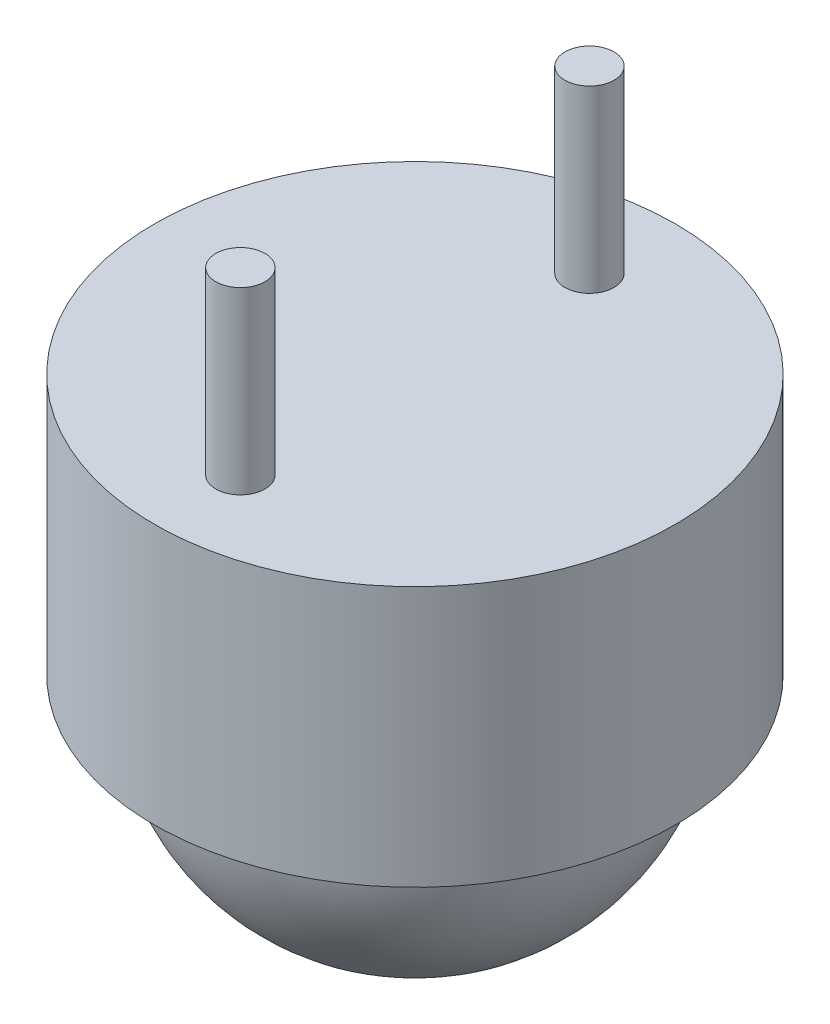
ISO-10303-21;
HEADER;
FILE_DESCRIPTION(('STEP AP214'),'2;1');
FILE_NAME('part.step','',(''),(''),'','','');
FILE_SCHEMA(('AUTOMOTIVE_DESIGN { 1 0 10303 214 1 1 1 1 }'));
ENDSEC;
DATA;
#1=APPLICATION_CONTEXT('core data for automotive mechanical design processes');
#2=APPLICATION_PROTOCOL_DEFINITION('international standard','automotive_design',2000,#1);
#3=PRODUCT_CONTEXT('',#1,'mechanical');
#4=PRODUCT('Part','Part','',(#3));
#5=PRODUCT_RELATED_PRODUCT_CATEGORY('part','',(#4));
#6=PRODUCT_DEFINITION_FORMATION('','',#4);
#7=PRODUCT_DEFINITION_CONTEXT('part definition',#1,'design');
#8=PRODUCT_DEFINITION('design','',#6,#7);
#9=PRODUCT_DEFINITION_SHAPE('','',#8);
#10=(LENGTH_UNIT() NAMED_UNIT(*) SI_UNIT(.MILLI.,.METRE.));
#11=(NAMED_UNIT(*) PLANE_ANGLE_UNIT() SI_UNIT($,.RADIAN.));
#12=(NAMED_UNIT(*) SI_UNIT($,.STERADIAN.) SOLID_ANGLE_UNIT());
#13=UNCERTAINTY_MEASURE_WITH_UNIT(LENGTH_MEASURE(1.E-05),#10,'distance_accuracy_value','');
#14=(GEOMETRIC_REPRESENTATION_CONTEXT(3) GLOBAL_UNCERTAINTY_ASSIGNED_CONTEXT((#13)) GLOBAL_UNIT_ASSIGNED_CONTEXT((#10,
#11,#12)) REPRESENTATION_CONTEXT('',''));
#15=CARTESIAN_POINT('',(0.,0.,0.));
#16=DIRECTION('',(0.,0.,1.));
#17=DIRECTION('',(1.,0.,0.));
#18=AXIS2_PLACEMENT_3D('',#15,#16,#17);
#19=CARTESIAN_POINT('',(0.,19.525,-7.747));
#20=DIRECTION('',(0.,-1.,0.));
#21=DIRECTION('',(0.,0.,-1.));
#22=AXIS2_PLACEMENT_3D('',#19,#20,#21);
#23=CYLINDRICAL_SURFACE('',#22,1.09);
#24=CARTESIAN_POINT('',(0.,19.525,-7.747));
#25=DIRECTION('',(0.,-1.,0.));
#26=DIRECTION('',(0.,0.,-1.));
#27=AXIS2_PLACEMENT_3D('',#24,#25,#26);
#28=CIRCLE('',#27,1.09);
#29=CARTESIAN_POINT('',(0.,19.525,-8.837));
#30=VERTEX_POINT('',#29);
#31=EDGE_CURVE('E56',#30,#30,#28,.T.);
#32=ORIENTED_EDGE('',*,*,#31,.T.);
#33=EDGE_LOOP('',(#32));
#34=FACE_BOUND('',#33,.T.);
#35=CARTESIAN_POINT('',(0.,9.525,-7.747));
#36=DIRECTION('',(0.,-1.,0.));
#37=DIRECTION('',(0.,0.,-1.));
#38=AXIS2_PLACEMENT_3D('',#35,#36,#37);
#39=CIRCLE('',#38,1.09);
#40=CARTESIAN_POINT('',(0.,9.525,-8.837));
#41=VERTEX_POINT('',#40);
#42=EDGE_CURVE('E11',#41,#41,#39,.T.);
#43=ORIENTED_EDGE('',*,*,#42,.F.);
#44=EDGE_LOOP('',(#43));
#45=FACE_BOUND('',#44,.T.);
#46=ADVANCED_FACE('F52',(#34,#45),#23,.T.);
#47=CARTESIAN_POINT('',(0.,19.525,-7.747));
#48=DIRECTION('',(0.,-1.,0.));
#49=DIRECTION('',(0.,0.,-1.));
#50=AXIS2_PLACEMENT_3D('',#47,#48,#49);
#51=PLANE('',#50);
#52=ORIENTED_EDGE('',*,*,#31,.F.);
#53=EDGE_LOOP('',(#52));
#54=FACE_BOUND('',#53,.T.);
#55=ADVANCED_FACE('F54',(#54),#51,.F.);
#56=CARTESIAN_POINT('',(0.,9.525,-7.747));
#57=DIRECTION('',(0.,-1.,0.));
#58=DIRECTION('',(0.,0.,-1.));
#59=AXIS2_PLACEMENT_3D('',#56,#57,#58);
#60=PLANE('',#59);
#61=ORIENTED_EDGE('',*,*,#42,.T.);
#62=EDGE_LOOP('',(#61));
#63=FACE_BOUND('',#62,.T.);
#64=ADVANCED_FACE('F68',(#63),#60,.T.);
#65=CLOSED_SHELL('',(#46,#55,#64));
#66=MANIFOLD_SOLID_BREP('B2',#65);
#67=CARTESIAN_POINT('',(0.,19.525,7.747));
#68=DIRECTION('',(0.,-1.,0.));
#69=DIRECTION('',(0.,0.,-1.));
#70=AXIS2_PLACEMENT_3D('',#67,#68,#69);
#71=CYLINDRICAL_SURFACE('',#70,1.09);
#72=CARTESIAN_POINT('',(0.,19.525,7.747));
#73=DIRECTION('',(0.,-1.,0.));
#74=DIRECTION('',(0.,0.,-1.));
#75=AXIS2_PLACEMENT_3D('',#72,#73,#74);
#76=CIRCLE('',#75,1.09);
#77=CARTESIAN_POINT('',(0.,19.525,6.657));
#78=VERTEX_POINT('',#77);
#79=EDGE_CURVE('E51',#78,#78,#76,.T.);
#80=ORIENTED_EDGE('',*,*,#79,.T.);
#81=EDGE_LOOP('',(#80));
#82=FACE_BOUND('',#81,.T.);
#83=CARTESIAN_POINT('',(0.,9.525,7.747));
#84=DIRECTION('',(0.,-1.,0.));
#85=DIRECTION('',(0.,0.,-1.));
#86=AXIS2_PLACEMENT_3D('',#83,#84,#85);
#87=CIRCLE('',#86,1.09);
#88=CARTESIAN_POINT('',(0.,9.525,6.657));
#89=VERTEX_POINT('',#88);
#90=EDGE_CURVE('E104',#89,#89,#87,.T.);
#91=ORIENTED_EDGE('',*,*,#90,.F.);
#92=EDGE_LOOP('',(#91));
#93=FACE_BOUND('',#92,.T.);
#94=ADVANCED_FACE('F101',(#82,#93),#71,.T.);
#95=CARTESIAN_POINT('',(0.,19.525,7.747));
#96=DIRECTION('',(0.,-1.,0.));
#97=DIRECTION('',(0.,0.,-1.));
#98=AXIS2_PLACEMENT_3D('',#95,#96,#97);
#99=PLANE('',#98);
#100=ORIENTED_EDGE('',*,*,#79,.F.);
#101=EDGE_LOOP('',(#100));
#102=FACE_BOUND('',#101,.T.);
#103=ADVANCED_FACE('F116',(#102),#99,.F.);
#104=CARTESIAN_POINT('',(0.,9.525,7.747));
#105=DIRECTION('',(0.,-1.,0.));
#106=DIRECTION('',(0.,0.,-1.));
#107=AXIS2_PLACEMENT_3D('',#104,#105,#106);
#108=PLANE('',#107);
#109=ORIENTED_EDGE('',*,*,#90,.T.);
#110=EDGE_LOOP('',(#109));
#111=FACE_BOUND('',#110,.T.);
#112=ADVANCED_FACE('F113',(#111),#108,.T.);
#113=CLOSED_SHELL('',(#94,#103,#112));
#114=MANIFOLD_SOLID_BREP('B6',#113);
#115=CARTESIAN_POINT('',(0.,0.,0.));
#116=DIRECTION('',(0.,1.,0.));
#117=DIRECTION('',(0.,0.,1.));
#118=AXIS2_PLACEMENT_3D('',#115,#116,#117);
#119=PLANE('',#118);
#120=CARTESIAN_POINT('',(0.,0.,0.));
#121=DIRECTION('',(0.,1.,0.));
#122=DIRECTION('',(0.,0.,1.));
#123=AXIS2_PLACEMENT_3D('',#120,#121,#122);
#124=CIRCLE('',#123,11.557);
#125=CARTESIAN_POINT('',(0.,0.,-11.557));
#126=VERTEX_POINT('',#125);
#127=EDGE_CURVE('E100',#126,#126,#124,.T.);
#128=ORIENTED_EDGE('',*,*,#127,.F.);
#129=EDGE_LOOP('',(#128));
#130=FACE_BOUND('',#129,.T.);
#131=CARTESIAN_POINT('',(0.,0.,0.));
#132=DIRECTION('',(0.,1.,0.));
#133=DIRECTION('',(0.,0.,1.));
#134=AXIS2_PLACEMENT_3D('',#131,#132,#133);
#135=CIRCLE('',#134,9.525);
#136=CARTESIAN_POINT('',(0.,0.,-9.525));
#137=VERTEX_POINT('',#136);
#138=EDGE_CURVE('E156',#137,#137,#135,.T.);
#139=ORIENTED_EDGE('',*,*,#138,.T.);
#140=EDGE_LOOP('',(#139));
#141=FACE_BOUND('',#140,.T.);
#142=ADVANCED_FACE('F149',(#130,#141),#119,.F.);
#143=CARTESIAN_POINT('',(0.,9.525,0.));
#144=DIRECTION('',(0.,-1.,0.));
#145=DIRECTION('',(0.,0.,-1.));
#146=AXIS2_PLACEMENT_3D('',#143,#144,#145);
#147=CYLINDRICAL_SURFACE('',#146,11.557);
#148=CARTESIAN_POINT('',(0.,11.557,0.));
#149=DIRECTION('',(0.,1.,0.));
#150=DIRECTION('',(0.,0.,1.));
#151=AXIS2_PLACEMENT_3D('',#148,#149,#150);
#152=CIRCLE('',#151,11.557);
#153=CARTESIAN_POINT('',(0.,11.557,-11.557));
#154=VERTEX_POINT('',#153);
#155=EDGE_CURVE('E164',#154,#154,#152,.T.);
#156=CARTESIAN_POINT('',(0.,0.,-11.557));
#157=CARTESIAN_POINT('',(0.,0.120385416666667,-11.557));
#158=CARTESIAN_POINT('',(0.,0.240770833333333,-11.557));
#159=CARTESIAN_POINT('',(0.,0.481541666666667,-11.557));
#160=CARTESIAN_POINT('',(0.,0.601927083333334,-11.557));
#161=CARTESIAN_POINT('',(0.,0.842697916666667,-11.557));
#162=CARTESIAN_POINT('',(0.,0.963083333333334,-11.557));
#163=CARTESIAN_POINT('',(0.,1.20385416666667,-11.557));
#164=CARTESIAN_POINT('',(0.,1.32423958333333,-11.557));
#165=CARTESIAN_POINT('',(0.,1.56501041666667,-11.557));
#166=CARTESIAN_POINT('',(0.,1.68539583333333,-11.557));
#167=CARTESIAN_POINT('',(0.,1.92616666666667,-11.557));
#168=CARTESIAN_POINT('',(0.,2.04655208333333,-11.557));
#169=CARTESIAN_POINT('',(0.,2.28732291666667,-11.557));
#170=CARTESIAN_POINT('',(0.,2.40770833333333,-11.557));
#171=CARTESIAN_POINT('',(0.,2.64847916666667,-11.557));
#172=CARTESIAN_POINT('',(0.,2.76886458333333,-11.557));
#173=CARTESIAN_POINT('',(0.,3.00963541666667,-11.557));
#174=CARTESIAN_POINT('',(0.,3.13002083333333,-11.557));
#175=CARTESIAN_POINT('',(0.,3.37079166666667,-11.557));
#176=CARTESIAN_POINT('',(0.,3.49117708333333,-11.557));
#177=CARTESIAN_POINT('',(0.,3.73194791666667,-11.557));
#178=CARTESIAN_POINT('',(0.,3.85233333333333,-11.557));
#179=CARTESIAN_POINT('',(0.,4.09310416666667,-11.557));
#180=CARTESIAN_POINT('',(0.,4.21348958333333,-11.557));
#181=CARTESIAN_POINT('',(0.,4.45426041666667,-11.557));
#182=CARTESIAN_POINT('',(0.,4.57464583333333,-11.557));
#183=CARTESIAN_POINT('',(0.,4.81541666666667,-11.557));
#184=CARTESIAN_POINT('',(0.,4.93580208333333,-11.557));
#185=CARTESIAN_POINT('',(0.,5.17657291666667,-11.557));
#186=CARTESIAN_POINT('',(0.,5.29695833333333,-11.557));
#187=CARTESIAN_POINT('',(0.,5.53772916666667,-11.557));
#188=CARTESIAN_POINT('',(0.,5.65811458333333,-11.557));
#189=CARTESIAN_POINT('',(0.,5.89888541666667,-11.557));
#190=CARTESIAN_POINT('',(0.,6.01927083333333,-11.557));
#191=CARTESIAN_POINT('',(0.,6.26004166666667,-11.557));
#192=CARTESIAN_POINT('',(0.,6.38042708333333,-11.557));
#193=CARTESIAN_POINT('',(0.,6.62119791666667,-11.557));
#194=CARTESIAN_POINT('',(0.,6.74158333333333,-11.557));
#195=CARTESIAN_POINT('',(0.,6.98235416666667,-11.557));
#196=CARTESIAN_POINT('',(0.,7.10273958333333,-11.557));
#197=CARTESIAN_POINT('',(0.,7.34351041666667,-11.557));
#198=CARTESIAN_POINT('',(0.,7.46389583333333,-11.557));
#199=CARTESIAN_POINT('',(0.,7.70466666666667,-11.557));
#200=CARTESIAN_POINT('',(0.,7.82505208333333,-11.557));
#201=CARTESIAN_POINT('',(0.,8.06582291666667,-11.557));
#202=CARTESIAN_POINT('',(0.,8.18620833333333,-11.557));
#203=CARTESIAN_POINT('',(0.,8.42697916666667,-11.557));
#204=CARTESIAN_POINT('',(0.,8.54736458333333,-11.557));
#205=CARTESIAN_POINT('',(0.,8.78813541666667,-11.557));
#206=CARTESIAN_POINT('',(0.,8.90852083333333,-11.557));
#207=CARTESIAN_POINT('',(0.,9.14929166666667,-11.557));
#208=CARTESIAN_POINT('',(0.,9.26967708333333,-11.557));
#209=CARTESIAN_POINT('',(0.,9.51044791666667,-11.557));
#210=CARTESIAN_POINT('',(0.,9.63083333333333,-11.557));
#211=CARTESIAN_POINT('',(0.,9.87160416666667,-11.557));
#212=CARTESIAN_POINT('',(0.,9.99198958333333,-11.557));
#213=CARTESIAN_POINT('',(0.,10.2327604166667,-11.557));
#214=CARTESIAN_POINT('',(0.,10.3531458333333,-11.557));
#215=CARTESIAN_POINT('',(0.,10.5939166666667,-11.557));
#216=CARTESIAN_POINT('',(0.,10.7143020833333,-11.557));
#217=CARTESIAN_POINT('',(0.,10.9550729166667,-11.557));
#218=CARTESIAN_POINT('',(0.,11.0754583333333,-11.557));
#219=CARTESIAN_POINT('',(0.,11.3162291666667,-11.557));
#220=CARTESIAN_POINT('',(0.,11.4366145833333,-11.557));
#221=CARTESIAN_POINT('',(0.,11.557,-11.557));
#222=B_SPLINE_CURVE_WITH_KNOTS('',3,(#156,#157,#158,#159,#160,#161,#162,#163,#164,#165,#166,
#167,#168,#169,#170,#171,#172,#173,#174,#175,#176,#177,#178,#179,#180,#181,#182,#183,#184,#185,
#186,#187,#188,#189,#190,#191,#192,#193,#194,#195,#196,#197,#198,#199,#200,#201,#202,#203,#204,
#205,#206,#207,#208,#209,#210,#211,#212,#213,#214,#215,#216,#217,#218,#219,#220,#221),
.UNSPECIFIED.,.F.,.F.,(4,2,2,2,2,2,2,2,2,2,2,2,2,2,2,2,2,2,2,2,2,2,2,2,2,2,2,2,2,2,2,2,4),(0.,
0.36115625,0.722312500000001,1.08346875,1.444625,1.80578125,2.1669375,2.52809375,2.88925,
3.25040625,3.6115625,3.97271875,4.333875,4.69503125,5.0561875,5.41734375,5.7785,6.13965625,
6.5008125,6.86196875,7.223125,7.58428125,7.9454375,8.30659375,8.66775,9.02890625,9.3900625,
9.75121875,10.112375,10.47353125,10.8346875,11.19584375,11.557),.UNSPECIFIED.);
#223=EDGE_CURVE('BSEAM151',#126,#154,#222,.T.);
#224=ORIENTED_EDGE('',*,*,#127,.T.);
#225=ORIENTED_EDGE('',*,*,#155,.F.);
#226=ORIENTED_EDGE('',*,*,#223,.T.);
#227=ORIENTED_EDGE('',*,*,#223,.F.);
#228=EDGE_LOOP('',(#224,#226,#225,#227));
#229=FACE_BOUND('',#228,.T.);
#230=ADVANCED_FACE('F151',(#229),#147,.T.);
#231=CARTESIAN_POINT('',(0.,9.525,0.));
#232=DIRECTION('',(0.,-1.,0.));
#233=DIRECTION('',(0.,0.,-1.));
#234=AXIS2_PLACEMENT_3D('',#231,#232,#233);
#235=CYLINDRICAL_SURFACE('',#234,9.525);
#236=CARTESIAN_POINT('',(0.,9.525,0.));
#237=DIRECTION('',(0.,1.,0.));
#238=DIRECTION('',(0.,0.,1.));
#239=AXIS2_PLACEMENT_3D('',#236,#237,#238);
#240=CIRCLE('',#239,9.525);
#241=CARTESIAN_POINT('',(0.,9.525,-9.525));
#242=VERTEX_POINT('',#241);
#243=EDGE_CURVE('E160',#242,#242,#240,.T.);
#244=CARTESIAN_POINT('',(0.,9.525,-9.525));
#245=CARTESIAN_POINT('',(0.,9.42578125,-9.525));
#246=CARTESIAN_POINT('',(0.,9.3265625,-9.525));
#247=CARTESIAN_POINT('',(0.,9.128125,-9.525));
#248=CARTESIAN_POINT('',(0.,9.02890625,-9.525));
#249=CARTESIAN_POINT('',(0.,8.83046875,-9.525));
#250=CARTESIAN_POINT('',(0.,8.73125,-9.525));
#251=CARTESIAN_POINT('',(0.,8.5328125,-9.525));
#252=CARTESIAN_POINT('',(0.,8.43359375,-9.525));
#253=CARTESIAN_POINT('',(0.,8.23515625,-9.525));
#254=CARTESIAN_POINT('',(0.,8.1359375,-9.525));
#255=CARTESIAN_POINT('',(0.,7.9375,-9.525));
#256=CARTESIAN_POINT('',(0.,7.83828125,-9.525));
#257=CARTESIAN_POINT('',(0.,7.63984375,-9.525));
#258=CARTESIAN_POINT('',(0.,7.540625,-9.525));
#259=CARTESIAN_POINT('',(0.,7.3421875,-9.525));
#260=CARTESIAN_POINT('',(0.,7.24296875,-9.525));
#261=CARTESIAN_POINT('',(0.,7.04453125,-9.525));
#262=CARTESIAN_POINT('',(0.,6.9453125,-9.525));
#263=CARTESIAN_POINT('',(0.,6.746875,-9.525));
#264=CARTESIAN_POINT('',(0.,6.64765625,-9.525));
#265=CARTESIAN_POINT('',(0.,6.44921875,-9.525));
#266=CARTESIAN_POINT('',(0.,6.35,-9.525));
#267=CARTESIAN_POINT('',(0.,6.1515625,-9.525));
#268=CARTESIAN_POINT('',(0.,6.05234375,-9.525));
#269=CARTESIAN_POINT('',(0.,5.85390625,-9.525));
#270=CARTESIAN_POINT('',(0.,5.7546875,-9.525));
#271=CARTESIAN_POINT('',(0.,5.55625,-9.525));
#272=CARTESIAN_POINT('',(0.,5.45703125,-9.525));
#273=CARTESIAN_POINT('',(0.,5.25859375,-9.525));
#274=CARTESIAN_POINT('',(0.,5.159375,-9.525));
#275=CARTESIAN_POINT('',(0.,4.9609375,-9.525));
#276=CARTESIAN_POINT('',(0.,4.86171875,-9.525));
#277=CARTESIAN_POINT('',(0.,4.66328125,-9.525));
#278=CARTESIAN_POINT('',(0.,4.5640625,-9.525));
#279=CARTESIAN_POINT('',(0.,4.365625,-9.525));
#280=CARTESIAN_POINT('',(0.,4.26640625,-9.525));
#281=CARTESIAN_POINT('',(0.,4.06796875,-9.525));
#282=CARTESIAN_POINT('',(0.,3.96875,-9.525));
#283=CARTESIAN_POINT('',(0.,3.7703125,-9.525));
#284=CARTESIAN_POINT('',(0.,3.67109375,-9.525));
#285=CARTESIAN_POINT('',(0.,3.47265625,-9.525));
#286=CARTESIAN_POINT('',(0.,3.3734375,-9.525));
#287=CARTESIAN_POINT('',(0.,3.175,-9.525));
#288=CARTESIAN_POINT('',(0.,3.07578125,-9.525));
#289=CARTESIAN_POINT('',(0.,2.87734375,-9.525));
#290=CARTESIAN_POINT('',(0.,2.778125,-9.525));
#291=CARTESIAN_POINT('',(0.,2.5796875,-9.525));
#292=CARTESIAN_POINT('',(0.,2.48046875,-9.525));
#293=CARTESIAN_POINT('',(0.,2.28203125,-9.525));
#294=CARTESIAN_POINT('',(0.,2.1828125,-9.525));
#295=CARTESIAN_POINT('',(0.,1.984375,-9.525));
#296=CARTESIAN_POINT('',(0.,1.88515625,-9.525));
#297=CARTESIAN_POINT('',(0.,1.68671875,-9.525));
#298=CARTESIAN_POINT('',(0.,1.5875,-9.525));
#299=CARTESIAN_POINT('',(0.,1.3890625,-9.525));
#300=CARTESIAN_POINT('',(0.,1.28984375,-9.525));
#301=CARTESIAN_POINT('',(0.,1.09140625,-9.525));
#302=CARTESIAN_POINT('',(0.,0.992187500000001,-9.525));
#303=CARTESIAN_POINT('',(0.,0.793750000000001,-9.525));
#304=CARTESIAN_POINT('',(0.,0.69453125,-9.525));
#305=CARTESIAN_POINT('',(0.,0.49609375,-9.525));
#306=CARTESIAN_POINT('',(0.,0.396875,-9.525));
#307=CARTESIAN_POINT('',(0.,0.1984375,-9.525));
#308=CARTESIAN_POINT('',(0.,0.0992187500000001,-9.525));
#309=CARTESIAN_POINT('',(0.,0.,-9.525));
#310=B_SPLINE_CURVE_WITH_KNOTS('',3,(#244,#245,#246,#247,#248,#249,#250,#251,#252,#253,#254,
#255,#256,#257,#258,#259,#260,#261,#262,#263,#264,#265,#266,#267,#268,#269,#270,#271,#272,#273,
#274,#275,#276,#277,#278,#279,#280,#281,#282,#283,#284,#285,#286,#287,#288,#289,#290,#291,#292,
#293,#294,#295,#296,#297,#298,#299,#300,#301,#302,#303,#304,#305,#306,#307,#308,#309),
.UNSPECIFIED.,.F.,.F.,(4,2,2,2,2,2,2,2,2,2,2,2,2,2,2,2,2,2,2,2,2,2,2,2,2,2,2,2,2,2,2,2,4),(0.,
0.29765625,0.5953125,0.892968750000001,1.190625,1.48828125,1.7859375,2.08359375,2.38125,
2.67890625,2.9765625,3.27421875,3.571875,3.86953125,4.1671875,4.46484375,4.7625,5.06015625,
5.3578125,5.65546875,5.953125,6.25078125,6.5484375,6.84609375,7.14375,7.44140625,7.7390625,
8.03671875,8.334375,8.63203125,8.9296875,9.22734375,9.525),.UNSPECIFIED.);
#311=EDGE_CURVE('BSEAM196',#242,#137,#310,.T.);
#312=ORIENTED_EDGE('',*,*,#243,.T.);
#313=ORIENTED_EDGE('',*,*,#138,.F.);
#314=ORIENTED_EDGE('',*,*,#311,.T.);
#315=ORIENTED_EDGE('',*,*,#311,.F.);
#316=EDGE_LOOP('',(#312,#314,#313,#315));
#317=FACE_BOUND('',#316,.T.);
#318=ADVANCED_FACE('F196',(#317),#235,.F.);
#319=CARTESIAN_POINT('',(0.,9.525,0.));
#320=DIRECTION('',(0.,1.,0.));
#321=DIRECTION('',(0.,0.,1.));
#322=AXIS2_PLACEMENT_3D('',#319,#320,#321);
#323=PLANE('',#322);
#324=CARTESIAN_POINT('',(0.,9.525,-7.747));
#325=DIRECTION('',(0.,1.,0.));
#326=DIRECTION('',(0.,0.,1.));
#327=AXIS2_PLACEMENT_3D('',#324,#325,#326);
#328=CIRCLE('',#327,1.09);
#329=CARTESIAN_POINT('',(0.,9.525,-6.657));
#330=VERTEX_POINT('',#329);
#331=EDGE_CURVE('E169',#330,#330,#328,.F.);
#332=ORIENTED_EDGE('',*,*,#331,.F.);
#333=EDGE_LOOP('',(#332));
#334=FACE_BOUND('',#333,.T.);
#335=CARTESIAN_POINT('',(0.,9.525,7.747));
#336=DIRECTION('',(0.,1.,0.));
#337=DIRECTION('',(0.,0.,1.));
#338=AXIS2_PLACEMENT_3D('',#335,#336,#337);
#339=CIRCLE('',#338,1.09);
#340=CARTESIAN_POINT('',(0.,9.525,8.837));
#341=VERTEX_POINT('',#340);
#342=EDGE_CURVE('E174',#341,#341,#339,.F.);
#343=ORIENTED_EDGE('',*,*,#342,.F.);
#344=EDGE_LOOP('',(#343));
#345=FACE_BOUND('',#344,.T.);
#346=ORIENTED_EDGE('',*,*,#243,.F.);
#347=EDGE_LOOP('',(#346));
#348=FACE_BOUND('',#347,.T.);
#349=ADVANCED_FACE('F189',(#334,#345,#348),#323,.F.);
#350=CARTESIAN_POINT('',(0.,11.557,0.));
#351=DIRECTION('',(0.,1.,0.));
#352=DIRECTION('',(0.,0.,1.));
#353=AXIS2_PLACEMENT_3D('',#350,#351,#352);
#354=PLANE('',#353);
#355=CARTESIAN_POINT('',(0.,11.557,-7.747));
#356=DIRECTION('',(0.,1.,0.));
#357=DIRECTION('',(0.,0.,1.));
#358=AXIS2_PLACEMENT_3D('',#355,#356,#357);
#359=CIRCLE('',#358,1.09);
#360=CARTESIAN_POINT('',(0.,11.557,-6.657));
#361=VERTEX_POINT('',#360);
#362=EDGE_CURVE('E173',#361,#361,#359,.T.);
#363=ORIENTED_EDGE('',*,*,#362,.F.);
#364=EDGE_LOOP('',(#363));
#365=FACE_BOUND('',#364,.T.);
#366=CARTESIAN_POINT('',(0.,11.557,7.747));
#367=DIRECTION('',(0.,1.,0.));
#368=DIRECTION('',(0.,0.,1.));
#369=AXIS2_PLACEMENT_3D('',#366,#367,#368);
#370=CIRCLE('',#369,1.09);
#371=CARTESIAN_POINT('',(0.,11.557,8.837));
#372=VERTEX_POINT('',#371);
#373=EDGE_CURVE('E170',#372,#372,#370,.T.);
#374=ORIENTED_EDGE('',*,*,#373,.F.);
#375=EDGE_LOOP('',(#374));
#376=FACE_BOUND('',#375,.T.);
#377=ORIENTED_EDGE('',*,*,#155,.T.);
#378=EDGE_LOOP('',(#377));
#379=FACE_BOUND('',#378,.T.);
#380=ADVANCED_FACE('F185',(#365,#376,#379),#354,.T.);
#381=CARTESIAN_POINT('',(0.,-9.526,7.747));
#382=DIRECTION('',(0.,1.,0.));
#383=DIRECTION('',(0.,0.,1.));
#384=AXIS2_PLACEMENT_3D('',#381,#382,#383);
#385=CYLINDRICAL_SURFACE('',#384,1.09);
#386=CARTESIAN_POINT('',(0.,11.557,8.837));
#387=CARTESIAN_POINT('',(0.,11.5358333333333,8.837));
#388=CARTESIAN_POINT('',(0.,11.5146666666667,8.837));
#389=CARTESIAN_POINT('',(0.,11.4723333333333,8.837));
#390=CARTESIAN_POINT('',(0.,11.4511666666667,8.837));
#391=CARTESIAN_POINT('',(0.,11.4088333333333,8.837));
#392=CARTESIAN_POINT('',(0.,11.3876666666667,8.837));
#393=CARTESIAN_POINT('',(0.,11.3453333333333,8.837));
#394=CARTESIAN_POINT('',(0.,11.3241666666667,8.837));
#395=CARTESIAN_POINT('',(0.,11.2818333333333,8.837));
#396=CARTESIAN_POINT('',(0.,11.2606666666667,8.837));
#397=CARTESIAN_POINT('',(0.,11.2183333333333,8.837));
#398=CARTESIAN_POINT('',(0.,11.1971666666667,8.837));
#399=CARTESIAN_POINT('',(0.,11.1548333333333,8.837));
#400=CARTESIAN_POINT('',(0.,11.1336666666667,8.837));
#401=CARTESIAN_POINT('',(0.,11.0913333333333,8.837));
#402=CARTESIAN_POINT('',(0.,11.0701666666667,8.837));
#403=CARTESIAN_POINT('',(0.,11.0278333333333,8.837));
#404=CARTESIAN_POINT('',(0.,11.0066666666667,8.837));
#405=CARTESIAN_POINT('',(0.,10.9643333333333,8.837));
#406=CARTESIAN_POINT('',(0.,10.9431666666667,8.837));
#407=CARTESIAN_POINT('',(0.,10.9008333333333,8.837));
#408=CARTESIAN_POINT('',(0.,10.8796666666667,8.837));
#409=CARTESIAN_POINT('',(0.,10.8373333333333,8.837));
#410=CARTESIAN_POINT('',(0.,10.8161666666667,8.837));
#411=CARTESIAN_POINT('',(0.,10.7738333333333,8.837));
#412=CARTESIAN_POINT('',(0.,10.7526666666667,8.837));
#413=CARTESIAN_POINT('',(0.,10.7103333333333,8.837));
#414=CARTESIAN_POINT('',(0.,10.6891666666667,8.837));
#415=CARTESIAN_POINT('',(0.,10.6468333333333,8.837));
#416=CARTESIAN_POINT('',(0.,10.6256666666667,8.837));
#417=CARTESIAN_POINT('',(0.,10.5833333333333,8.837));
#418=CARTESIAN_POINT('',(0.,10.5621666666667,8.837));
#419=CARTESIAN_POINT('',(0.,10.5198333333333,8.837));
#420=CARTESIAN_POINT('',(0.,10.4986666666667,8.837));
#421=CARTESIAN_POINT('',(0.,10.4563333333333,8.837));
#422=CARTESIAN_POINT('',(0.,10.4351666666667,8.837));
#423=CARTESIAN_POINT('',(0.,10.3928333333333,8.837));
#424=CARTESIAN_POINT('',(0.,10.3716666666667,8.837));
#425=CARTESIAN_POINT('',(0.,10.3293333333333,8.837));
#426=CARTESIAN_POINT('',(0.,10.3081666666667,8.837));
#427=CARTESIAN_POINT('',(0.,10.2658333333333,8.837));
#428=CARTESIAN_POINT('',(0.,10.2446666666667,8.837));
#429=CARTESIAN_POINT('',(0.,10.2023333333333,8.837));
#430=CARTESIAN_POINT('',(0.,10.1811666666667,8.837));
#431=CARTESIAN_POINT('',(0.,10.1388333333333,8.837));
#432=CARTESIAN_POINT('',(0.,10.1176666666667,8.837));
#433=CARTESIAN_POINT('',(0.,10.0753333333333,8.837));
#434=CARTESIAN_POINT('',(0.,10.0541666666667,8.837));
#435=CARTESIAN_POINT('',(0.,10.0118333333333,8.837));
#436=CARTESIAN_POINT('',(0.,9.99066666666666,8.837));
#437=CARTESIAN_POINT('',(0.,9.94833333333333,8.837));
#438=CARTESIAN_POINT('',(0.,9.92716666666666,8.837));
#439=CARTESIAN_POINT('',(0.,9.88483333333333,8.837));
#440=CARTESIAN_POINT('',(0.,9.86366666666666,8.837));
#441=CARTESIAN_POINT('',(0.,9.82133333333333,8.837));
#442=CARTESIAN_POINT('',(0.,9.80016666666666,8.837));
#443=CARTESIAN_POINT('',(0.,9.75783333333333,8.837));
#444=CARTESIAN_POINT('',(0.,9.73666666666666,8.837));
#445=CARTESIAN_POINT('',(0.,9.69433333333333,8.837));
#446=CARTESIAN_POINT('',(0.,9.67316666666666,8.837));
#447=CARTESIAN_POINT('',(0.,9.63083333333333,8.837));
#448=CARTESIAN_POINT('',(0.,9.60966666666666,8.837));
#449=CARTESIAN_POINT('',(0.,9.56733333333333,8.837));
#450=CARTESIAN_POINT('',(0.,9.54616666666666,8.837));
#451=CARTESIAN_POINT('',(0.,9.525,8.837));
#452=B_SPLINE_CURVE_WITH_KNOTS('',3,(#386,#387,#388,#389,#390,#391,#392,#393,#394,#395,#396,
#397,#398,#399,#400,#401,#402,#403,#404,#405,#406,#407,#408,#409,#410,#411,#412,#413,#414,#415,
#416,#417,#418,#419,#420,#421,#422,#423,#424,#425,#426,#427,#428,#429,#430,#431,#432,#433,#434,
#435,#436,#437,#438,#439,#440,#441,#442,#443,#444,#445,#446,#447,#448,#449,#450,#451),
.UNSPECIFIED.,.F.,.F.,(4,2,2,2,2,2,2,2,2,2,2,2,2,2,2,2,2,2,2,2,2,2,2,2,2,2,2,2,2,2,2,2,4),(0.,
0.0635000000000011,0.127000000000002,0.1905,0.254000000000001,0.317500000000002,
0.380999999999999,0.4445,0.508000000000002,0.571500000000003,0.635000000000004,
0.698500000000001,0.762000000000002,0.825500000000003,0.889000000000001,0.952500000000002,1.016,
1.0795,1.14300000000001,1.2065,1.27,1.3335,1.397,1.4605,1.524,1.58750000000001,1.65100000000001,
1.7145,1.77800000000001,1.84150000000001,1.905,1.96850000000001,2.03200000000001),.UNSPECIFIED.);
#453=EDGE_CURVE('BSEAM188',#372,#341,#452,.T.);
#454=ORIENTED_EDGE('',*,*,#373,.T.);
#455=ORIENTED_EDGE('',*,*,#342,.T.);
#456=ORIENTED_EDGE('',*,*,#453,.T.);
#457=ORIENTED_EDGE('',*,*,#453,.F.);
#458=EDGE_LOOP('',(#454,#456,#455,#457));
#459=FACE_BOUND('',#458,.T.);
#460=ADVANCED_FACE('F188',(#459),#385,.F.);
#461=CARTESIAN_POINT('',(0.,-9.526,-7.747));
#462=DIRECTION('',(0.,1.,0.));
#463=DIRECTION('',(0.,0.,1.));
#464=AXIS2_PLACEMENT_3D('',#461,#462,#463);
#465=CYLINDRICAL_SURFACE('',#464,1.09);
#466=CARTESIAN_POINT('',(0.,11.557,-6.657));
#467=CARTESIAN_POINT('',(0.,11.5358333333333,-6.657));
#468=CARTESIAN_POINT('',(0.,11.5146666666667,-6.657));
#469=CARTESIAN_POINT('',(0.,11.4723333333333,-6.657));
#470=CARTESIAN_POINT('',(0.,11.4511666666667,-6.657));
#471=CARTESIAN_POINT('',(0.,11.4088333333333,-6.657));
#472=CARTESIAN_POINT('',(0.,11.3876666666667,-6.657));
#473=CARTESIAN_POINT('',(0.,11.3453333333333,-6.657));
#474=CARTESIAN_POINT('',(0.,11.3241666666667,-6.657));
#475=CARTESIAN_POINT('',(0.,11.2818333333333,-6.657));
#476=CARTESIAN_POINT('',(0.,11.2606666666667,-6.657));
#477=CARTESIAN_POINT('',(0.,11.2183333333333,-6.657));
#478=CARTESIAN_POINT('',(0.,11.1971666666667,-6.657));
#479=CARTESIAN_POINT('',(0.,11.1548333333333,-6.657));
#480=CARTESIAN_POINT('',(0.,11.1336666666667,-6.657));
#481=CARTESIAN_POINT('',(0.,11.0913333333333,-6.657));
#482=CARTESIAN_POINT('',(0.,11.0701666666667,-6.657));
#483=CARTESIAN_POINT('',(0.,11.0278333333333,-6.657));
#484=CARTESIAN_POINT('',(0.,11.0066666666667,-6.657));
#485=CARTESIAN_POINT('',(0.,10.9643333333333,-6.657));
#486=CARTESIAN_POINT('',(0.,10.9431666666667,-6.657));
#487=CARTESIAN_POINT('',(0.,10.9008333333333,-6.657));
#488=CARTESIAN_POINT('',(0.,10.8796666666667,-6.657));
#489=CARTESIAN_POINT('',(0.,10.8373333333333,-6.657));
#490=CARTESIAN_POINT('',(0.,10.8161666666667,-6.657));
#491=CARTESIAN_POINT('',(0.,10.7738333333333,-6.657));
#492=CARTESIAN_POINT('',(0.,10.7526666666667,-6.657));
#493=CARTESIAN_POINT('',(0.,10.7103333333333,-6.657));
#494=CARTESIAN_POINT('',(0.,10.6891666666667,-6.657));
#495=CARTESIAN_POINT('',(0.,10.6468333333333,-6.657));
#496=CARTESIAN_POINT('',(0.,10.6256666666667,-6.657));
#497=CARTESIAN_POINT('',(0.,10.5833333333333,-6.657));
#498=CARTESIAN_POINT('',(0.,10.5621666666667,-6.657));
#499=CARTESIAN_POINT('',(0.,10.5198333333333,-6.657));
#500=CARTESIAN_POINT('',(0.,10.4986666666667,-6.657));
#501=CARTESIAN_POINT('',(0.,10.4563333333333,-6.657));
#502=CARTESIAN_POINT('',(0.,10.4351666666667,-6.657));
#503=CARTESIAN_POINT('',(0.,10.3928333333333,-6.657));
#504=CARTESIAN_POINT('',(0.,10.3716666666667,-6.657));
#505=CARTESIAN_POINT('',(0.,10.3293333333333,-6.657));
#506=CARTESIAN_POINT('',(0.,10.3081666666667,-6.657));
#507=CARTESIAN_POINT('',(0.,10.2658333333333,-6.657));
#508=CARTESIAN_POINT('',(0.,10.2446666666667,-6.657));
#509=CARTESIAN_POINT('',(0.,10.2023333333333,-6.657));
#510=CARTESIAN_POINT('',(0.,10.1811666666667,-6.657));
#511=CARTESIAN_POINT('',(0.,10.1388333333333,-6.657));
#512=CARTESIAN_POINT('',(0.,10.1176666666667,-6.657));
#513=CARTESIAN_POINT('',(0.,10.0753333333333,-6.657));
#514=CARTESIAN_POINT('',(0.,10.0541666666667,-6.657));
#515=CARTESIAN_POINT('',(0.,10.0118333333333,-6.657));
#516=CARTESIAN_POINT('',(0.,9.99066666666666,-6.657));
#517=CARTESIAN_POINT('',(0.,9.94833333333333,-6.657));
#518=CARTESIAN_POINT('',(0.,9.92716666666666,-6.657));
#519=CARTESIAN_POINT('',(0.,9.88483333333333,-6.657));
#520=CARTESIAN_POINT('',(0.,9.86366666666666,-6.657));
#521=CARTESIAN_POINT('',(0.,9.82133333333333,-6.657));
#522=CARTESIAN_POINT('',(0.,9.80016666666666,-6.657));
#523=CARTESIAN_POINT('',(0.,9.75783333333333,-6.657));
#524=CARTESIAN_POINT('',(0.,9.73666666666666,-6.657));
#525=CARTESIAN_POINT('',(0.,9.69433333333333,-6.657));
#526=CARTESIAN_POINT('',(0.,9.67316666666666,-6.657));
#527=CARTESIAN_POINT('',(0.,9.63083333333333,-6.657));
#528=CARTESIAN_POINT('',(0.,9.60966666666666,-6.657));
#529=CARTESIAN_POINT('',(0.,9.56733333333333,-6.657));
#530=CARTESIAN_POINT('',(0.,9.54616666666666,-6.657));
#531=CARTESIAN_POINT('',(0.,9.525,-6.657));
#532=B_SPLINE_CURVE_WITH_KNOTS('',3,(#466,#467,#468,#469,#470,#471,#472,#473,#474,#475,#476,
#477,#478,#479,#480,#481,#482,#483,#484,#485,#486,#487,#488,#489,#490,#491,#492,#493,#494,#495,
#496,#497,#498,#499,#500,#501,#502,#503,#504,#505,#506,#507,#508,#509,#510,#511,#512,#513,#514,
#515,#516,#517,#518,#519,#520,#521,#522,#523,#524,#525,#526,#527,#528,#529,#530,#531),
.UNSPECIFIED.,.F.,.F.,(4,2,2,2,2,2,2,2,2,2,2,2,2,2,2,2,2,2,2,2,2,2,2,2,2,2,2,2,2,2,2,2,4),(0.,
0.0635000000000011,0.127000000000002,0.1905,0.254000000000001,0.317500000000002,
0.380999999999999,0.4445,0.508000000000002,0.571500000000003,0.635000000000004,
0.698500000000001,0.762000000000002,0.825500000000003,0.889000000000001,0.952500000000002,1.016,
1.0795,1.14300000000001,1.2065,1.27,1.3335,1.397,1.4605,1.524,1.58750000000001,1.65100000000001,
1.7145,1.77800000000001,1.84150000000001,1.905,1.96850000000001,2.03200000000001),.UNSPECIFIED.);
#533=EDGE_CURVE('BSEAM182',#361,#330,#532,.T.);
#534=ORIENTED_EDGE('',*,*,#362,.T.);
#535=ORIENTED_EDGE('',*,*,#331,.T.);
#536=ORIENTED_EDGE('',*,*,#533,.T.);
#537=ORIENTED_EDGE('',*,*,#533,.F.);
#538=EDGE_LOOP('',(#534,#536,#535,#537));
#539=FACE_BOUND('',#538,.T.);
#540=ADVANCED_FACE('F182',(#539),#465,.F.);
#541=CLOSED_SHELL('',(#142,#230,#318,#349,#380,#460,#540));
#542=MANIFOLD_SOLID_BREP('B46',#541);
#543=CARTESIAN_POINT('',(0.,0.,0.));
#544=DIRECTION('',(0.,-1.,0.));
#545=DIRECTION('',(-1.,0.,0.));
#546=AXIS2_PLACEMENT_3D('',#543,#544,#545);
#547=SPHERICAL_SURFACE('',#546,9.525);
#548=CARTESIAN_POINT('',(0.,9.525,0.));
#549=VERTEX_POINT('',#548);
#550=VERTEX_LOOP('',#549);
#551=FACE_BOUND('',#550,.T.);
#552=ADVANCED_FACE('F265',(#551),#547,.T.);
#553=CLOSED_SHELL('',(#552));
#554=MANIFOLD_SOLID_BREP('B95',#553);
#555=ADVANCED_BREP_SHAPE_REPRESENTATION('',(#18,#66,#114,#542,#554),#14);
#556=SHAPE_DEFINITION_REPRESENTATION(#9,#555);
ENDSEC;
END-ISO-10303-21;
